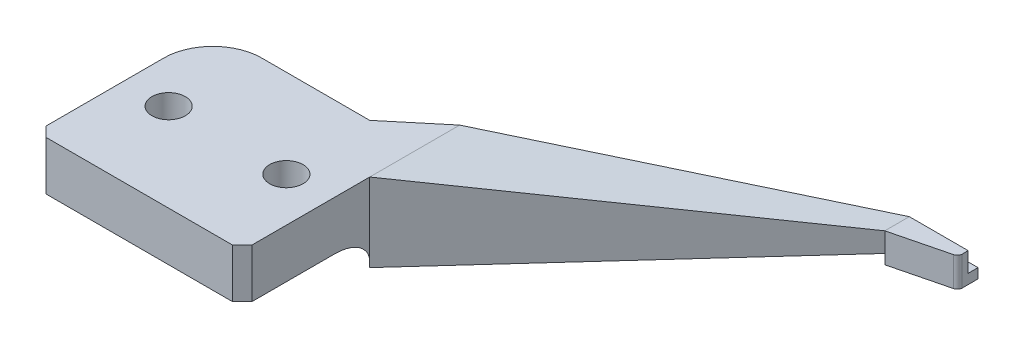
ISO-10303-21;
HEADER;
FILE_DESCRIPTION(('STEP AP214'),'2;1');
FILE_NAME('part.step','',(''),(''),'','','');
FILE_SCHEMA(('AUTOMOTIVE_DESIGN { 1 0 10303 214 1 1 1 1 }'));
ENDSEC;
DATA;
#1=APPLICATION_CONTEXT('core data for automotive mechanical design processes');
#2=APPLICATION_PROTOCOL_DEFINITION('international standard','automotive_design',2000,#1);
#3=PRODUCT_CONTEXT('',#1,'mechanical');
#4=PRODUCT('Part','Part','',(#3));
#5=PRODUCT_RELATED_PRODUCT_CATEGORY('part','',(#4));
#6=PRODUCT_DEFINITION_FORMATION('','',#4);
#7=PRODUCT_DEFINITION_CONTEXT('part definition',#1,'design');
#8=PRODUCT_DEFINITION('design','',#6,#7);
#9=PRODUCT_DEFINITION_SHAPE('','',#8);
#10=(LENGTH_UNIT() NAMED_UNIT(*) SI_UNIT(.MILLI.,.METRE.));
#11=(NAMED_UNIT(*) PLANE_ANGLE_UNIT() SI_UNIT($,.RADIAN.));
#12=(NAMED_UNIT(*) SI_UNIT($,.STERADIAN.) SOLID_ANGLE_UNIT());
#13=UNCERTAINTY_MEASURE_WITH_UNIT(LENGTH_MEASURE(1.E-05),#10,'distance_accuracy_value','');
#14=(GEOMETRIC_REPRESENTATION_CONTEXT(3) GLOBAL_UNCERTAINTY_ASSIGNED_CONTEXT((#13)) GLOBAL_UNIT_ASSIGNED_CONTEXT((#10,
#11,#12)) REPRESENTATION_CONTEXT('',''));
#15=CARTESIAN_POINT('',(0.,0.,0.));
#16=DIRECTION('',(0.,0.,1.));
#17=DIRECTION('',(1.,0.,0.));
#18=AXIS2_PLACEMENT_3D('',#15,#16,#17);
#19=CARTESIAN_POINT('',(10.5,5.,9.));
#20=DIRECTION('',(-1.,0.,0.));
#21=DIRECTION('',(0.,0.,1.));
#22=AXIS2_PLACEMENT_3D('',#19,#20,#21);
#23=PLANE('',#22);
#24=DIRECTION('',(0.,0.,-1.));
#25=VECTOR('',#24,1.);
#26=CARTESIAN_POINT('',(10.5,5.,9.));
#27=LINE('',#26,#25);
#28=CARTESIAN_POINT('',(10.5,5.,8.));
#29=VERTEX_POINT('',#28);
#30=CARTESIAN_POINT('',(10.5,5.,-4.00000000000001));
#31=VERTEX_POINT('',#30);
#32=EDGE_CURVE('E256',#29,#31,#27,.T.);
#33=ORIENTED_EDGE('',*,*,#32,.F.);
#34=DIRECTION('',(0.,-1.,0.));
#35=VECTOR('',#34,1.);
#36=CARTESIAN_POINT('',(10.5,5.,8.));
#37=LINE('',#36,#35);
#38=CARTESIAN_POINT('',(10.5,0.,8.));
#39=VERTEX_POINT('',#38);
#40=EDGE_CURVE('E305',#29,#39,#37,.T.);
#41=ORIENTED_EDGE('',*,*,#40,.T.);
#42=DIRECTION('',(0.,0.,-1.));
#43=VECTOR('',#42,1.);
#44=CARTESIAN_POINT('',(10.5,0.,9.));
#45=LINE('',#44,#43);
#46=CARTESIAN_POINT('',(10.5,0.,-0.464466094067259));
#47=VERTEX_POINT('',#46);
#48=EDGE_CURVE('E244',#39,#47,#45,.T.);
#49=ORIENTED_EDGE('',*,*,#48,.T.);
#50=CARTESIAN_POINT('',(10.5,-2.5,-0.464466094067259));
#51=DIRECTION('',(-1.,0.,0.));
#52=DIRECTION('',(0.,0.,1.));
#53=AXIS2_PLACEMENT_3D('',#50,#51,#52);
#54=ELLIPSE('',#53,3.53553390593274,2.5);
#55=CARTESIAN_POINT('',(10.5,-2.5,-4.));
#56=VERTEX_POINT('',#55);
#57=EDGE_CURVE('E293',#47,#56,#54,.T.);
#58=ORIENTED_EDGE('',*,*,#57,.T.);
#59=DIRECTION('',(0.,-1.,0.));
#60=VECTOR('',#59,1.);
#61=CARTESIAN_POINT('',(10.5,5.,-4.));
#62=LINE('',#61,#60);
#63=EDGE_CURVE('E242',#31,#56,#62,.T.);
#64=ORIENTED_EDGE('',*,*,#63,.F.);
#65=EDGE_LOOP('',(#33,#41,#49,#58,#64));
#66=FACE_BOUND('',#65,.T.);
#67=ADVANCED_FACE('F34',(#66),#23,.F.);
#68=CARTESIAN_POINT('',(-10.5,5.,-9.));
#69=DIRECTION('',(0.,0.,1.));
#70=DIRECTION('',(1.,0.,0.));
#71=AXIS2_PLACEMENT_3D('',#68,#69,#70);
#72=PLANE('',#71);
#73=DIRECTION('',(-1.,0.,0.));
#74=VECTOR('',#73,1.);
#75=CARTESIAN_POINT('',(-10.5,0.,-9.));
#76=LINE('',#75,#74);
#77=CARTESIAN_POINT('',(1.96446609406726,0.,-9.));
#78=VERTEX_POINT('',#77);
#79=CARTESIAN_POINT('',(-5.5,0.,-9.));
#80=VERTEX_POINT('',#79);
#81=EDGE_CURVE('E268',#78,#80,#76,.T.);
#82=ORIENTED_EDGE('',*,*,#81,.T.);
#83=DIRECTION('',(0.,-1.,0.));
#84=VECTOR('',#83,1.);
#85=CARTESIAN_POINT('',(-5.5,5.,-9.));
#86=LINE('',#85,#84);
#87=CARTESIAN_POINT('',(-5.5,5.,-9.));
#88=VERTEX_POINT('',#87);
#89=EDGE_CURVE('E301',#80,#88,#86,.F.);
#90=ORIENTED_EDGE('',*,*,#89,.T.);
#91=DIRECTION('',(-1.,0.,0.));
#92=VECTOR('',#91,1.);
#93=CARTESIAN_POINT('',(-10.5,5.,-9.));
#94=LINE('',#93,#92);
#95=CARTESIAN_POINT('',(5.5,5.,-9.));
#96=VERTEX_POINT('',#95);
#97=EDGE_CURVE('E258',#96,#88,#94,.T.);
#98=ORIENTED_EDGE('',*,*,#97,.F.);
#99=DIRECTION('',(0.,-1.,0.));
#100=VECTOR('',#99,1.);
#101=CARTESIAN_POINT('',(5.5,5.,-9.));
#102=LINE('',#101,#100);
#103=CARTESIAN_POINT('',(5.5,-2.5,-9.));
#104=VERTEX_POINT('',#103);
#105=EDGE_CURVE('E254',#96,#104,#102,.T.);
#106=ORIENTED_EDGE('',*,*,#105,.T.);
#107=CARTESIAN_POINT('',(1.96446609406726,-2.5,-9.));
#108=DIRECTION('',(0.,0.,1.));
#109=DIRECTION('',(1.,0.,0.));
#110=AXIS2_PLACEMENT_3D('',#107,#108,#109);
#111=ELLIPSE('',#110,3.53553390593274,2.5);
#112=EDGE_CURVE('E291',#104,#78,#111,.T.);
#113=ORIENTED_EDGE('',*,*,#112,.T.);
#114=EDGE_LOOP('',(#82,#90,#98,#106,#113));
#115=FACE_BOUND('',#114,.T.);
#116=ADVANCED_FACE('F361',(#115),#72,.F.);
#117=CARTESIAN_POINT('',(-10.5,5.,9.));
#118=DIRECTION('',(1.,0.,0.));
#119=DIRECTION('',(0.,0.,-1.));
#120=AXIS2_PLACEMENT_3D('',#117,#118,#119);
#121=PLANE('',#120);
#122=DIRECTION('',(0.,0.,1.));
#123=VECTOR('',#122,1.);
#124=CARTESIAN_POINT('',(-10.5,0.,9.));
#125=LINE('',#124,#123);
#126=CARTESIAN_POINT('',(-10.5,0.,-4.));
#127=VERTEX_POINT('',#126);
#128=CARTESIAN_POINT('',(-10.5,0.,8.));
#129=VERTEX_POINT('',#128);
#130=EDGE_CURVE('E271',#127,#129,#125,.T.);
#131=ORIENTED_EDGE('',*,*,#130,.T.);
#132=DIRECTION('',(0.,1.,0.));
#133=VECTOR('',#132,1.);
#134=CARTESIAN_POINT('',(-10.5,5.,8.));
#135=LINE('',#134,#133);
#136=CARTESIAN_POINT('',(-10.5,5.,8.));
#137=VERTEX_POINT('',#136);
#138=EDGE_CURVE('E11',#129,#137,#135,.T.);
#139=ORIENTED_EDGE('',*,*,#138,.T.);
#140=DIRECTION('',(0.,0.,1.));
#141=VECTOR('',#140,1.);
#142=CARTESIAN_POINT('',(-10.5,5.,9.));
#143=LINE('',#142,#141);
#144=CARTESIAN_POINT('',(-10.5,5.,-4.));
#145=VERTEX_POINT('',#144);
#146=EDGE_CURVE('E262',#145,#137,#143,.T.);
#147=ORIENTED_EDGE('',*,*,#146,.F.);
#148=DIRECTION('',(0.,-1.,0.));
#149=VECTOR('',#148,1.);
#150=CARTESIAN_POINT('',(-10.5,5.,-4.));
#151=LINE('',#150,#149);
#152=EDGE_CURVE('E296',#145,#127,#151,.T.);
#153=ORIENTED_EDGE('',*,*,#152,.T.);
#154=EDGE_LOOP('',(#131,#139,#147,#153));
#155=FACE_BOUND('',#154,.T.);
#156=ADVANCED_FACE('F354',(#155),#121,.F.);
#157=CARTESIAN_POINT('',(-10.5,5.,9.));
#158=DIRECTION('',(0.,0.,-1.));
#159=DIRECTION('',(-1.,0.,0.));
#160=AXIS2_PLACEMENT_3D('',#157,#158,#159);
#161=PLANE('',#160);
#162=DIRECTION('',(1.,0.,0.));
#163=VECTOR('',#162,1.);
#164=CARTESIAN_POINT('',(-10.5,0.,9.));
#165=LINE('',#164,#163);
#166=CARTESIAN_POINT('',(-9.50000000000001,0.,9.));
#167=VERTEX_POINT('',#166);
#168=CARTESIAN_POINT('',(9.49999999999999,0.,9.));
#169=VERTEX_POINT('',#168);
#170=EDGE_CURVE('E259',#167,#169,#165,.T.);
#171=ORIENTED_EDGE('',*,*,#170,.T.);
#172=DIRECTION('',(0.,1.,0.));
#173=VECTOR('',#172,1.);
#174=CARTESIAN_POINT('',(9.49999999999999,5.,9.));
#175=LINE('',#174,#173);
#176=CARTESIAN_POINT('',(9.49999999999999,5.,9.));
#177=VERTEX_POINT('',#176);
#178=EDGE_CURVE('E58',#169,#177,#175,.T.);
#179=ORIENTED_EDGE('',*,*,#178,.T.);
#180=DIRECTION('',(1.,0.,0.));
#181=VECTOR('',#180,1.);
#182=CARTESIAN_POINT('',(-10.5,5.,9.));
#183=LINE('',#182,#181);
#184=CARTESIAN_POINT('',(-9.50000000000001,5.,9.));
#185=VERTEX_POINT('',#184);
#186=EDGE_CURVE('E264',#185,#177,#183,.T.);
#187=ORIENTED_EDGE('',*,*,#186,.F.);
#188=DIRECTION('',(0.,-1.,0.));
#189=VECTOR('',#188,1.);
#190=CARTESIAN_POINT('',(-9.50000000000001,5.,9.));
#191=LINE('',#190,#189);
#192=EDGE_CURVE('E312',#185,#167,#191,.T.);
#193=ORIENTED_EDGE('',*,*,#192,.T.);
#194=EDGE_LOOP('',(#171,#179,#187,#193));
#195=FACE_BOUND('',#194,.T.);
#196=ADVANCED_FACE('F351',(#195),#161,.F.);
#197=CARTESIAN_POINT('',(0.,5.,0.));
#198=DIRECTION('',(0.,-1.,0.));
#199=DIRECTION('',(0.,0.,-1.));
#200=AXIS2_PLACEMENT_3D('',#197,#198,#199);
#201=PLANE('',#200);
#202=CARTESIAN_POINT('',(6.,5.,0.));
#203=DIRECTION('',(0.,1.,0.));
#204=DIRECTION('',(0.,0.,1.));
#205=AXIS2_PLACEMENT_3D('',#202,#203,#204);
#206=CIRCLE('',#205,1.7);
#207=CARTESIAN_POINT('',(6.,5.,1.7));
#208=VERTEX_POINT('',#207);
#209=EDGE_CURVE('E204',#208,#208,#206,.T.);
#210=ORIENTED_EDGE('',*,*,#209,.F.);
#211=EDGE_LOOP('',(#210));
#212=FACE_BOUND('',#211,.T.);
#213=CARTESIAN_POINT('',(-6.,5.,0.));
#214=DIRECTION('',(0.,1.,0.));
#215=DIRECTION('',(0.,0.,1.));
#216=AXIS2_PLACEMENT_3D('',#213,#214,#215);
#217=CIRCLE('',#216,1.7);
#218=CARTESIAN_POINT('',(-6.,5.,1.7));
#219=VERTEX_POINT('',#218);
#220=EDGE_CURVE('E203',#219,#219,#217,.T.);
#221=ORIENTED_EDGE('',*,*,#220,.F.);
#222=EDGE_LOOP('',(#221));
#223=FACE_BOUND('',#222,.T.);
#224=ORIENTED_EDGE('',*,*,#186,.T.);
#225=DIRECTION('',(-0.70710678118655,0.,0.707106781186545));
#226=VECTOR('',#225,1.);
#227=CARTESIAN_POINT('',(10.5,5.,8.));
#228=LINE('',#227,#226);
#229=EDGE_CURVE('E44',#177,#29,#228,.F.);
#230=ORIENTED_EDGE('',*,*,#229,.T.);
#231=ORIENTED_EDGE('',*,*,#32,.T.);
#232=DIRECTION('',(0.,0.,1.));
#233=VECTOR('',#232,1.);
#234=CARTESIAN_POINT('',(10.5,5.,-34.));
#235=LINE('',#234,#233);
#236=CARTESIAN_POINT('',(10.5,5.,-13.1666666666667));
#237=VERTEX_POINT('',#236);
#238=EDGE_CURVE('E219',#237,#31,#235,.T.);
#239=ORIENTED_EDGE('',*,*,#238,.F.);
#240=DIRECTION('',(0.768221279597376,0.,-0.64018439966448));
#241=VECTOR('',#240,1.);
#242=CARTESIAN_POINT('',(5.5,5.,-9.));
#243=LINE('',#242,#241);
#244=EDGE_CURVE('E237',#96,#237,#243,.T.);
#245=ORIENTED_EDGE('',*,*,#244,.F.);
#246=ORIENTED_EDGE('',*,*,#97,.T.);
#247=CARTESIAN_POINT('',(-5.5,5.,-4.));
#248=DIRECTION('',(0.,-1.,0.));
#249=DIRECTION('',(0.,0.,-1.));
#250=AXIS2_PLACEMENT_3D('',#247,#248,#249);
#251=CIRCLE('',#250,5.);
#252=EDGE_CURVE('E303',#88,#145,#251,.F.);
#253=ORIENTED_EDGE('',*,*,#252,.T.);
#254=ORIENTED_EDGE('',*,*,#146,.T.);
#255=DIRECTION('',(-0.707106781186545,0.,-0.70710678118655));
#256=VECTOR('',#255,1.);
#257=CARTESIAN_POINT('',(-9.50000000000001,5.,9.));
#258=LINE('',#257,#256);
#259=EDGE_CURVE('E316',#137,#185,#258,.F.);
#260=ORIENTED_EDGE('',*,*,#259,.T.);
#261=EDGE_LOOP('',(#224,#230,#231,#239,#245,#246,#253,#254,#260));
#262=FACE_BOUND('',#261,.T.);
#263=ADVANCED_FACE('F331',(#212,#223,#262),#201,.F.);
#264=CARTESIAN_POINT('',(0.,0.,0.));
#265=DIRECTION('',(0.,-1.,0.));
#266=DIRECTION('',(0.,0.,-1.));
#267=AXIS2_PLACEMENT_3D('',#264,#265,#266);
#268=PLANE('',#267);
#269=CARTESIAN_POINT('',(6.,0.,0.));
#270=DIRECTION('',(0.,-1.,0.));
#271=DIRECTION('',(0.,0.,-1.));
#272=AXIS2_PLACEMENT_3D('',#269,#270,#271);
#273=CIRCLE('',#272,1.7);
#274=CARTESIAN_POINT('',(6.,0.,-1.7));
#275=VERTEX_POINT('',#274);
#276=EDGE_CURVE('E39',#275,#275,#273,.T.);
#277=ORIENTED_EDGE('',*,*,#276,.F.);
#278=EDGE_LOOP('',(#277));
#279=FACE_BOUND('',#278,.T.);
#280=CARTESIAN_POINT('',(-6.,0.,0.));
#281=DIRECTION('',(0.,-1.,0.));
#282=DIRECTION('',(0.,0.,-1.));
#283=AXIS2_PLACEMENT_3D('',#280,#281,#282);
#284=CIRCLE('',#283,1.7);
#285=CARTESIAN_POINT('',(-6.,0.,-1.7));
#286=VERTEX_POINT('',#285);
#287=EDGE_CURVE('E207',#286,#286,#284,.T.);
#288=ORIENTED_EDGE('',*,*,#287,.F.);
#289=EDGE_LOOP('',(#288));
#290=FACE_BOUND('',#289,.T.);
#291=ORIENTED_EDGE('',*,*,#48,.F.);
#292=DIRECTION('',(0.70710678118655,0.,-0.707106781186545));
#293=VECTOR('',#292,1.);
#294=CARTESIAN_POINT('',(9.24999999999996,0.,9.25000000000003));
#295=LINE('',#294,#293);
#296=EDGE_CURVE('E310',#39,#169,#295,.F.);
#297=ORIENTED_EDGE('',*,*,#296,.T.);
#298=ORIENTED_EDGE('',*,*,#170,.F.);
#299=DIRECTION('',(0.707106781186545,0.,0.70710678118655));
#300=VECTOR('',#299,1.);
#301=CARTESIAN_POINT('',(-9.25000000000003,0.,9.24999999999997));
#302=LINE('',#301,#300);
#303=EDGE_CURVE('E308',#167,#129,#302,.F.);
#304=ORIENTED_EDGE('',*,*,#303,.T.);
#305=ORIENTED_EDGE('',*,*,#130,.F.);
#306=CARTESIAN_POINT('',(-5.5,0.,-4.));
#307=DIRECTION('',(0.,-1.,0.));
#308=DIRECTION('',(0.,0.,-1.));
#309=AXIS2_PLACEMENT_3D('',#306,#307,#308);
#310=CIRCLE('',#309,5.);
#311=EDGE_CURVE('E299',#127,#80,#310,.T.);
#312=ORIENTED_EDGE('',*,*,#311,.T.);
#313=ORIENTED_EDGE('',*,*,#81,.F.);
#314=DIRECTION('',(-0.707106781186548,0.,-0.707106781186547));
#315=VECTOR('',#314,1.);
#316=CARTESIAN_POINT('',(8.73223304703363,0.,-2.23223304703363));
#317=LINE('',#316,#315);
#318=EDGE_CURVE('E288',#78,#47,#317,.F.);
#319=ORIENTED_EDGE('',*,*,#318,.T.);
#320=EDGE_LOOP('',(#291,#297,#298,#304,#305,#312,#313,#319));
#321=FACE_BOUND('',#320,.T.);
#322=ADVANCED_FACE('F327',(#279,#290,#321),#268,.T.);
#323=CARTESIAN_POINT('',(10.5,5.,-4.));
#324=DIRECTION('',(-0.707106781186547,0.,0.707106781186548));
#325=DIRECTION('',(0.707106781186548,0.,0.707106781186547));
#326=AXIS2_PLACEMENT_3D('',#323,#324,#325);
#327=PLANE('',#326);
#328=CARTESIAN_POINT('',(10.5,-3.,-4.));
#329=VERTEX_POINT('',#328);
#330=EDGE_CURVE('E245',#56,#329,#62,.T.);
#331=ORIENTED_EDGE('',*,*,#330,.F.);
#332=DIRECTION('',(-0.707106781186548,0.,-0.707106781186547));
#333=VECTOR('',#332,1.);
#334=CARTESIAN_POINT('',(5.5,-2.5,-9.));
#335=LINE('',#334,#333);
#336=EDGE_CURVE('E285',#56,#104,#335,.T.);
#337=ORIENTED_EDGE('',*,*,#336,.T.);
#338=CARTESIAN_POINT('',(5.5,-3.,-8.99999999999999));
#339=VERTEX_POINT('',#338);
#340=EDGE_CURVE('E239',#104,#339,#102,.T.);
#341=ORIENTED_EDGE('',*,*,#340,.T.);
#342=DIRECTION('',(-0.707106781186548,0.,-0.707106781186547));
#343=VECTOR('',#342,1.);
#344=CARTESIAN_POINT('',(10.5,-3.,-4.));
#345=LINE('',#344,#343);
#346=EDGE_CURVE('E227',#329,#339,#345,.T.);
#347=ORIENTED_EDGE('',*,*,#346,.F.);
#348=EDGE_LOOP('',(#331,#337,#341,#347));
#349=FACE_BOUND('',#348,.T.);
#350=ADVANCED_FACE('F330',(#349),#327,.T.);
#351=CARTESIAN_POINT('',(10.5,5.,-4.));
#352=DIRECTION('',(0.739940073395944,0.,0.672672793996313));
#353=DIRECTION('',(0.672672793996313,0.,-0.739940073395944));
#354=AXIS2_PLACEMENT_3D('',#351,#352,#353);
#355=PLANE('',#354);
#356=DIRECTION('',(0.664074457014679,-0.159377869683523,-0.730481902716146));
#357=VECTOR('',#356,1.);
#358=CARTESIAN_POINT('',(10.5,5.,-4.));
#359=LINE('',#358,#357);
#360=CARTESIAN_POINT('',(35.5,-1.,-31.5));
#361=VERTEX_POINT('',#360);
#362=EDGE_CURVE('E233',#31,#361,#359,.T.);
#363=ORIENTED_EDGE('',*,*,#362,.F.);
#364=ORIENTED_EDGE('',*,*,#63,.T.);
#365=ORIENTED_EDGE('',*,*,#330,.T.);
#366=DIRECTION('',(-0.672672793996313,0.,0.739940073395944));
#367=VECTOR('',#366,1.);
#368=CARTESIAN_POINT('',(10.5,-3.,-4.));
#369=LINE('',#368,#367);
#370=CARTESIAN_POINT('',(35.5,-3.,-31.5));
#371=VERTEX_POINT('',#370);
#372=EDGE_CURVE('E230',#371,#329,#369,.T.);
#373=ORIENTED_EDGE('',*,*,#372,.F.);
#374=DIRECTION('',(0.,-1.,0.));
#375=VECTOR('',#374,1.);
#376=CARTESIAN_POINT('',(35.5,5.,-31.5));
#377=LINE('',#376,#375);
#378=EDGE_CURVE('E246',#361,#371,#377,.T.);
#379=ORIENTED_EDGE('',*,*,#378,.F.);
#380=EDGE_LOOP('',(#363,#364,#365,#373,#379));
#381=FACE_BOUND('',#380,.T.);
#382=ADVANCED_FACE('F392',(#381),#355,.T.);
#383=CARTESIAN_POINT('',(35.5,5.,-31.5));
#384=DIRECTION('',(0.242535625036333,0.,0.970142500145332));
#385=DIRECTION('',(0.970142500145332,0.,-0.242535625036333));
#386=AXIS2_PLACEMENT_3D('',#383,#384,#385);
#387=PLANE('',#386);
#388=DIRECTION('',(-0.970142500145332,0.,0.242535625036333));
#389=VECTOR('',#388,1.);
#390=CARTESIAN_POINT('',(35.5,-4.,-31.5));
#391=LINE('',#390,#389);
#392=CARTESIAN_POINT('',(41.1212678125182,-4.,-32.9053169531295));
#393=VERTEX_POINT('',#392);
#394=CARTESIAN_POINT('',(35.5,-4.,-31.5));
#395=VERTEX_POINT('',#394);
#396=EDGE_CURVE('E175',#393,#395,#391,.T.);
#397=ORIENTED_EDGE('',*,*,#396,.F.);
#398=DIRECTION('',(0.,-1.,0.));
#399=VECTOR('',#398,1.);
#400=CARTESIAN_POINT('',(41.1212678125182,5.,-32.9053169531295));
#401=LINE('',#400,#399);
#402=CARTESIAN_POINT('',(41.1212678125182,-1.,-32.9053169531295));
#403=VERTEX_POINT('',#402);
#404=EDGE_CURVE('E281',#393,#403,#401,.F.);
#405=ORIENTED_EDGE('',*,*,#404,.T.);
#406=DIRECTION('',(0.970142500145332,0.,-0.242535625036333));
#407=VECTOR('',#406,1.);
#408=CARTESIAN_POINT('',(35.5,-1.,-31.5));
#409=LINE('',#408,#407);
#410=EDGE_CURVE('E176',#361,#403,#409,.T.);
#411=ORIENTED_EDGE('',*,*,#410,.F.);
#412=ORIENTED_EDGE('',*,*,#378,.T.);
#413=DIRECTION('',(0.,1.,0.));
#414=VECTOR('',#413,1.);
#415=CARTESIAN_POINT('',(35.5,5.,-31.5));
#416=LINE('',#415,#414);
#417=EDGE_CURVE('E218',#395,#371,#416,.T.);
#418=ORIENTED_EDGE('',*,*,#417,.F.);
#419=EDGE_LOOP('',(#397,#405,#411,#412,#418));
#420=FACE_BOUND('',#419,.T.);
#421=ADVANCED_FACE('F386',(#420),#387,.T.);
#422=CARTESIAN_POINT('',(41.5,5.,-34.));
#423=DIRECTION('',(1.,0.,0.));
#424=DIRECTION('',(0.,0.,-1.));
#425=AXIS2_PLACEMENT_3D('',#422,#423,#424);
#426=PLANE('',#425);
#427=DIRECTION('',(0.,0.,1.));
#428=VECTOR('',#427,1.);
#429=CARTESIAN_POINT('',(41.5,-1.,-34.));
#430=LINE('',#429,#428);
#431=CARTESIAN_POINT('',(41.5,-1.,-34.));
#432=VERTEX_POINT('',#431);
#433=CARTESIAN_POINT('',(41.5,-1.,-33.3903882032022));
#434=VERTEX_POINT('',#433);
#435=EDGE_CURVE('E213',#432,#434,#430,.T.);
#436=ORIENTED_EDGE('',*,*,#435,.T.);
#437=DIRECTION('',(0.,-1.,0.));
#438=VECTOR('',#437,1.);
#439=CARTESIAN_POINT('',(41.5,5.,-33.3903882032022));
#440=LINE('',#439,#438);
#441=CARTESIAN_POINT('',(41.5,-4.,-33.3903882032022));
#442=VERTEX_POINT('',#441);
#443=EDGE_CURVE('E173',#434,#442,#440,.T.);
#444=ORIENTED_EDGE('',*,*,#443,.T.);
#445=DIRECTION('',(0.,0.,1.));
#446=VECTOR('',#445,1.);
#447=CARTESIAN_POINT('',(41.5,-4.,-34.));
#448=LINE('',#447,#446);
#449=CARTESIAN_POINT('',(41.5,-4.,-35.));
#450=VERTEX_POINT('',#449);
#451=EDGE_CURVE('E165',#450,#442,#448,.T.);
#452=ORIENTED_EDGE('',*,*,#451,.F.);
#453=DIRECTION('',(0.,-1.,0.));
#454=VECTOR('',#453,1.);
#455=CARTESIAN_POINT('',(41.5,-3.,-35.));
#456=LINE('',#455,#454);
#457=CARTESIAN_POINT('',(41.5,-3.,-35.));
#458=VERTEX_POINT('',#457);
#459=EDGE_CURVE('E171',#458,#450,#456,.T.);
#460=ORIENTED_EDGE('',*,*,#459,.F.);
#461=DIRECTION('',(0.,0.,1.));
#462=VECTOR('',#461,1.);
#463=CARTESIAN_POINT('',(41.5,-3.,-35.));
#464=LINE('',#463,#462);
#465=CARTESIAN_POINT('',(41.5,-3.,-34.));
#466=VERTEX_POINT('',#465);
#467=EDGE_CURVE('E197',#458,#466,#464,.T.);
#468=ORIENTED_EDGE('',*,*,#467,.T.);
#469=DIRECTION('',(0.,-1.,0.));
#470=VECTOR('',#469,1.);
#471=CARTESIAN_POINT('',(41.5,5.,-34.));
#472=LINE('',#471,#470);
#473=EDGE_CURVE('E249',#432,#466,#472,.T.);
#474=ORIENTED_EDGE('',*,*,#473,.F.);
#475=EDGE_LOOP('',(#436,#444,#452,#460,#468,#474));
#476=FACE_BOUND('',#475,.T.);
#477=ADVANCED_FACE('F168',(#476),#426,.T.);
#478=CARTESIAN_POINT('',(35.5,5.,-34.));
#479=DIRECTION('',(0.,0.,-1.));
#480=DIRECTION('',(-1.,0.,0.));
#481=AXIS2_PLACEMENT_3D('',#478,#479,#480);
#482=PLANE('',#481);
#483=DIRECTION('',(1.,0.,0.));
#484=VECTOR('',#483,1.);
#485=CARTESIAN_POINT('',(35.5,-3.,-34.));
#486=LINE('',#485,#484);
#487=CARTESIAN_POINT('',(35.5,-3.,-34.));
#488=VERTEX_POINT('',#487);
#489=EDGE_CURVE('E191',#488,#466,#486,.T.);
#490=ORIENTED_EDGE('',*,*,#489,.F.);
#491=DIRECTION('',(0.,-1.,0.));
#492=VECTOR('',#491,1.);
#493=CARTESIAN_POINT('',(35.5,5.,-34.));
#494=LINE('',#493,#492);
#495=CARTESIAN_POINT('',(35.5,-1.,-34.));
#496=VERTEX_POINT('',#495);
#497=EDGE_CURVE('E251',#496,#488,#494,.T.);
#498=ORIENTED_EDGE('',*,*,#497,.F.);
#499=DIRECTION('',(1.,0.,0.));
#500=VECTOR('',#499,1.);
#501=CARTESIAN_POINT('',(35.5,-1.,-34.));
#502=LINE('',#501,#500);
#503=EDGE_CURVE('E210',#496,#432,#502,.T.);
#504=ORIENTED_EDGE('',*,*,#503,.T.);
#505=ORIENTED_EDGE('',*,*,#473,.T.);
#506=EDGE_LOOP('',(#490,#498,#504,#505));
#507=FACE_BOUND('',#506,.T.);
#508=ADVANCED_FACE('F401',(#507),#482,.T.);
#509=CARTESIAN_POINT('',(5.5,5.,-9.));
#510=DIRECTION('',(-0.64018439966448,0.,-0.768221279597376));
#511=DIRECTION('',(-0.768221279597376,0.,0.64018439966448));
#512=AXIS2_PLACEMENT_3D('',#509,#510,#511);
#513=PLANE('',#512);
#514=DIRECTION('',(-0.755487774036081,0.18131706576866,0.629573145030068));
#515=VECTOR('',#514,1.);
#516=CARTESIAN_POINT('',(5.66437939169478,6.16054894599325,-9.13698282641231));
#517=LINE('',#516,#515);
#518=EDGE_CURVE('E276',#496,#237,#517,.T.);
#519=ORIENTED_EDGE('',*,*,#518,.F.);
#520=ORIENTED_EDGE('',*,*,#497,.T.);
#521=DIRECTION('',(0.768221279597376,0.,-0.64018439966448));
#522=VECTOR('',#521,1.);
#523=CARTESIAN_POINT('',(5.5,-3.,-9.));
#524=LINE('',#523,#522);
#525=EDGE_CURVE('E266',#339,#488,#524,.T.);
#526=ORIENTED_EDGE('',*,*,#525,.F.);
#527=ORIENTED_EDGE('',*,*,#340,.F.);
#528=ORIENTED_EDGE('',*,*,#105,.F.);
#529=ORIENTED_EDGE('',*,*,#244,.T.);
#530=EDGE_LOOP('',(#519,#520,#526,#527,#528,#529));
#531=FACE_BOUND('',#530,.T.);
#532=ADVANCED_FACE('F373',(#531),#513,.T.);
#533=CARTESIAN_POINT('',(0.,-4.,0.));
#534=DIRECTION('',(0.,-1.,0.));
#535=DIRECTION('',(0.,0.,-1.));
#536=AXIS2_PLACEMENT_3D('',#533,#534,#535);
#537=PLANE('',#536);
#538=ORIENTED_EDGE('',*,*,#451,.T.);
#539=CARTESIAN_POINT('',(41.,-4.,-33.3903882032022));
#540=DIRECTION('',(0.,-1.,0.));
#541=DIRECTION('',(0.,0.,-1.));
#542=AXIS2_PLACEMENT_3D('',#539,#540,#541);
#543=CIRCLE('',#542,0.5);
#544=EDGE_CURVE('E279',#442,#393,#543,.T.);
#545=ORIENTED_EDGE('',*,*,#544,.T.);
#546=ORIENTED_EDGE('',*,*,#396,.T.);
#547=DIRECTION('',(0.,0.,1.));
#548=VECTOR('',#547,1.);
#549=CARTESIAN_POINT('',(35.5,-4.,-34.));
#550=LINE('',#549,#548);
#551=CARTESIAN_POINT('',(35.5,-4.,-35.));
#552=VERTEX_POINT('',#551);
#553=EDGE_CURVE('E182',#552,#395,#550,.T.);
#554=ORIENTED_EDGE('',*,*,#553,.F.);
#555=DIRECTION('',(-1.,0.,0.));
#556=VECTOR('',#555,1.);
#557=CARTESIAN_POINT('',(35.5,-4.,-35.));
#558=LINE('',#557,#556);
#559=EDGE_CURVE('E179',#450,#552,#558,.T.);
#560=ORIENTED_EDGE('',*,*,#559,.F.);
#561=EDGE_LOOP('',(#538,#545,#546,#554,#560));
#562=FACE_BOUND('',#561,.T.);
#563=ADVANCED_FACE('F180',(#562),#537,.T.);
#564=CARTESIAN_POINT('',(35.5,-3.,-34.));
#565=DIRECTION('',(0.,1.,0.));
#566=DIRECTION('',(-1.,0.,0.));
#567=AXIS2_PLACEMENT_3D('',#564,#565,#566);
#568=PLANE('',#567);
#569=ORIENTED_EDGE('',*,*,#372,.T.);
#570=ORIENTED_EDGE('',*,*,#346,.T.);
#571=ORIENTED_EDGE('',*,*,#525,.T.);
#572=DIRECTION('',(0.,0.,1.));
#573=VECTOR('',#572,1.);
#574=CARTESIAN_POINT('',(35.5,-3.,-34.));
#575=LINE('',#574,#573);
#576=EDGE_CURVE('E214',#488,#371,#575,.T.);
#577=ORIENTED_EDGE('',*,*,#576,.T.);
#578=EDGE_LOOP('',(#569,#570,#571,#577));
#579=FACE_BOUND('',#578,.T.);
#580=ADVANCED_FACE('F378',(#579),#568,.F.);
#581=CARTESIAN_POINT('',(35.5,-4.,-34.));
#582=DIRECTION('',(1.,0.,0.));
#583=DIRECTION('',(0.,0.,-1.));
#584=AXIS2_PLACEMENT_3D('',#581,#582,#583);
#585=PLANE('',#584);
#586=ORIENTED_EDGE('',*,*,#417,.T.);
#587=ORIENTED_EDGE('',*,*,#576,.F.);
#588=DIRECTION('',(0.,0.,1.));
#589=VECTOR('',#588,1.);
#590=CARTESIAN_POINT('',(35.5,-3.,-35.));
#591=LINE('',#590,#589);
#592=CARTESIAN_POINT('',(35.5,-3.,-35.));
#593=VERTEX_POINT('',#592);
#594=EDGE_CURVE('E200',#593,#488,#591,.T.);
#595=ORIENTED_EDGE('',*,*,#594,.F.);
#596=DIRECTION('',(0.,1.,0.));
#597=VECTOR('',#596,1.);
#598=CARTESIAN_POINT('',(35.5,-3.,-35.));
#599=LINE('',#598,#597);
#600=EDGE_CURVE('E185',#552,#593,#599,.T.);
#601=ORIENTED_EDGE('',*,*,#600,.F.);
#602=ORIENTED_EDGE('',*,*,#553,.T.);
#603=EDGE_LOOP('',(#586,#587,#595,#601,#602));
#604=FACE_BOUND('',#603,.T.);
#605=ADVANCED_FACE('F382',(#604),#585,.F.);
#606=CARTESIAN_POINT('',(35.5,-1.,-34.));
#607=DIRECTION('',(0.,-1.,0.));
#608=DIRECTION('',(0.,0.,-1.));
#609=AXIS2_PLACEMENT_3D('',#606,#607,#608);
#610=PLANE('',#609);
#611=ORIENTED_EDGE('',*,*,#410,.T.);
#612=CARTESIAN_POINT('',(41.,-1.,-33.3903882032022));
#613=DIRECTION('',(0.,-1.,0.));
#614=DIRECTION('',(0.,0.,-1.));
#615=AXIS2_PLACEMENT_3D('',#612,#613,#614);
#616=CIRCLE('',#615,0.5);
#617=EDGE_CURVE('E283',#403,#434,#616,.F.);
#618=ORIENTED_EDGE('',*,*,#617,.T.);
#619=ORIENTED_EDGE('',*,*,#435,.F.);
#620=ORIENTED_EDGE('',*,*,#503,.F.);
#621=DIRECTION('',(0.,0.,1.));
#622=VECTOR('',#621,1.);
#623=CARTESIAN_POINT('',(35.5,-1.,-34.));
#624=LINE('',#623,#622);
#625=EDGE_CURVE('E215',#496,#361,#624,.T.);
#626=ORIENTED_EDGE('',*,*,#625,.T.);
#627=EDGE_LOOP('',(#611,#618,#619,#620,#626));
#628=FACE_BOUND('',#627,.T.);
#629=ADVANCED_FACE('F397',(#628),#610,.F.);
#630=CARTESIAN_POINT('',(35.5,-1.,-34.));
#631=DIRECTION('',(-0.233372952475324,-0.972387301980517,0.));
#632=DIRECTION('',(0.972387301980517,-0.233372952475324,0.));
#633=AXIS2_PLACEMENT_3D('',#630,#631,#632);
#634=PLANE('',#633);
#635=ORIENTED_EDGE('',*,*,#362,.T.);
#636=ORIENTED_EDGE('',*,*,#625,.F.);
#637=ORIENTED_EDGE('',*,*,#518,.T.);
#638=ORIENTED_EDGE('',*,*,#238,.T.);
#639=EDGE_LOOP('',(#635,#636,#637,#638));
#640=FACE_BOUND('',#639,.T.);
#641=ADVANCED_FACE('F395',(#640),#634,.F.);
#642=CARTESIAN_POINT('',(41.,5.,-33.3903882032022));
#643=DIRECTION('',(0.,-1.,0.));
#644=DIRECTION('',(0.,0.,-1.));
#645=AXIS2_PLACEMENT_3D('',#642,#643,#644);
#646=CYLINDRICAL_SURFACE('',#645,0.5);
#647=ORIENTED_EDGE('',*,*,#617,.F.);
#648=ORIENTED_EDGE('',*,*,#404,.F.);
#649=ORIENTED_EDGE('',*,*,#544,.F.);
#650=ORIENTED_EDGE('',*,*,#443,.F.);
#651=EDGE_LOOP('',(#647,#648,#649,#650));
#652=FACE_BOUND('',#651,.T.);
#653=ADVANCED_FACE('F421',(#652),#646,.T.);
#654=CARTESIAN_POINT('',(8.73223304703363,-2.5,-2.23223304703363));
#655=DIRECTION('',(0.707106781186548,0.,0.707106781186547));
#656=DIRECTION('',(0.707106781186547,0.,-0.707106781186548));
#657=AXIS2_PLACEMENT_3D('',#654,#655,#656);
#658=CYLINDRICAL_SURFACE('',#657,2.5);
#659=ORIENTED_EDGE('',*,*,#57,.F.);
#660=ORIENTED_EDGE('',*,*,#318,.F.);
#661=ORIENTED_EDGE('',*,*,#112,.F.);
#662=ORIENTED_EDGE('',*,*,#336,.F.);
#663=EDGE_LOOP('',(#659,#660,#661,#662));
#664=FACE_BOUND('',#663,.T.);
#665=ADVANCED_FACE('F365',(#664),#658,.F.);
#666=CARTESIAN_POINT('',(-5.5,5.,-4.));
#667=DIRECTION('',(0.,-1.,0.));
#668=DIRECTION('',(0.,0.,-1.));
#669=AXIS2_PLACEMENT_3D('',#666,#667,#668);
#670=CYLINDRICAL_SURFACE('',#669,5.);
#671=ORIENTED_EDGE('',*,*,#252,.F.);
#672=ORIENTED_EDGE('',*,*,#89,.F.);
#673=ORIENTED_EDGE('',*,*,#311,.F.);
#674=ORIENTED_EDGE('',*,*,#152,.F.);
#675=EDGE_LOOP('',(#671,#672,#673,#674));
#676=FACE_BOUND('',#675,.T.);
#677=ADVANCED_FACE('F358',(#676),#670,.T.);
#678=CARTESIAN_POINT('',(10.5,5.,8.));
#679=DIRECTION('',(-0.707106781186545,0.,-0.70710678118655));
#680=DIRECTION('',(0.,-1.,0.));
#681=AXIS2_PLACEMENT_3D('',#678,#679,#680);
#682=PLANE('',#681);
#683=ORIENTED_EDGE('',*,*,#229,.F.);
#684=ORIENTED_EDGE('',*,*,#178,.F.);
#685=ORIENTED_EDGE('',*,*,#296,.F.);
#686=ORIENTED_EDGE('',*,*,#40,.F.);
#687=EDGE_LOOP('',(#683,#684,#685,#686));
#688=FACE_BOUND('',#687,.T.);
#689=ADVANCED_FACE('F346',(#688),#682,.F.);
#690=CARTESIAN_POINT('',(-9.50000000000001,5.,9.));
#691=DIRECTION('',(0.70710678118655,0.,-0.707106781186545));
#692=DIRECTION('',(0.,-1.,0.));
#693=AXIS2_PLACEMENT_3D('',#690,#691,#692);
#694=PLANE('',#693);
#695=ORIENTED_EDGE('',*,*,#259,.F.);
#696=ORIENTED_EDGE('',*,*,#138,.F.);
#697=ORIENTED_EDGE('',*,*,#303,.F.);
#698=ORIENTED_EDGE('',*,*,#192,.F.);
#699=EDGE_LOOP('',(#695,#696,#697,#698));
#700=FACE_BOUND('',#699,.T.);
#701=ADVANCED_FACE('F37',(#700),#694,.F.);
#702=CARTESIAN_POINT('',(-6.,-4.,0.));
#703=DIRECTION('',(0.,1.,0.));
#704=DIRECTION('',(0.,0.,1.));
#705=AXIS2_PLACEMENT_3D('',#702,#703,#704);
#706=CYLINDRICAL_SURFACE('',#705,1.7);
#707=ORIENTED_EDGE('',*,*,#287,.T.);
#708=EDGE_LOOP('',(#707));
#709=FACE_BOUND('',#708,.T.);
#710=ORIENTED_EDGE('',*,*,#220,.T.);
#711=EDGE_LOOP('',(#710));
#712=FACE_BOUND('',#711,.T.);
#713=ADVANCED_FACE('F411',(#709,#712),#706,.F.);
#714=CARTESIAN_POINT('',(6.,-4.,0.));
#715=DIRECTION('',(0.,1.,0.));
#716=DIRECTION('',(0.,0.,1.));
#717=AXIS2_PLACEMENT_3D('',#714,#715,#716);
#718=CYLINDRICAL_SURFACE('',#717,1.7);
#719=ORIENTED_EDGE('',*,*,#276,.T.);
#720=EDGE_LOOP('',(#719));
#721=FACE_BOUND('',#720,.T.);
#722=ORIENTED_EDGE('',*,*,#209,.T.);
#723=EDGE_LOOP('',(#722));
#724=FACE_BOUND('',#723,.T.);
#725=ADVANCED_FACE('F324',(#721,#724),#718,.F.);
#726=CARTESIAN_POINT('',(35.5,-3.,-35.));
#727=DIRECTION('',(0.,-1.,0.));
#728=DIRECTION('',(1.,0.,0.));
#729=AXIS2_PLACEMENT_3D('',#726,#727,#728);
#730=PLANE('',#729);
#731=ORIENTED_EDGE('',*,*,#489,.T.);
#732=ORIENTED_EDGE('',*,*,#467,.F.);
#733=DIRECTION('',(1.,0.,0.));
#734=VECTOR('',#733,1.);
#735=CARTESIAN_POINT('',(35.5,-3.,-35.));
#736=LINE('',#735,#734);
#737=EDGE_CURVE('E189',#593,#458,#736,.T.);
#738=ORIENTED_EDGE('',*,*,#737,.F.);
#739=ORIENTED_EDGE('',*,*,#594,.T.);
#740=EDGE_LOOP('',(#731,#732,#738,#739));
#741=FACE_BOUND('',#740,.T.);
#742=ADVANCED_FACE('F403',(#741),#730,.F.);
#743=CARTESIAN_POINT('',(0.,0.,-35.));
#744=DIRECTION('',(0.,0.,1.));
#745=DIRECTION('',(1.,0.,0.));
#746=AXIS2_PLACEMENT_3D('',#743,#744,#745);
#747=PLANE('',#746);
#748=ORIENTED_EDGE('',*,*,#459,.T.);
#749=ORIENTED_EDGE('',*,*,#559,.T.);
#750=ORIENTED_EDGE('',*,*,#600,.T.);
#751=ORIENTED_EDGE('',*,*,#737,.T.);
#752=EDGE_LOOP('',(#748,#749,#750,#751));
#753=FACE_BOUND('',#752,.T.);
#754=ADVANCED_FACE('F187',(#753),#747,.F.);
#755=CLOSED_SHELL('',(#67,#116,#156,#196,#263,#322,#350,#382,#421,#477,#508,#532,#563,#580,#605,
#629,#641,#653,#665,#677,#689,#701,#713,#725,#742,#754));
#756=MANIFOLD_SOLID_BREP('B2',#755);
#757=ADVANCED_BREP_SHAPE_REPRESENTATION('',(#18,#756),#14);
#758=SHAPE_DEFINITION_REPRESENTATION(#9,#757);
ENDSEC;
END-ISO-10303-21;
